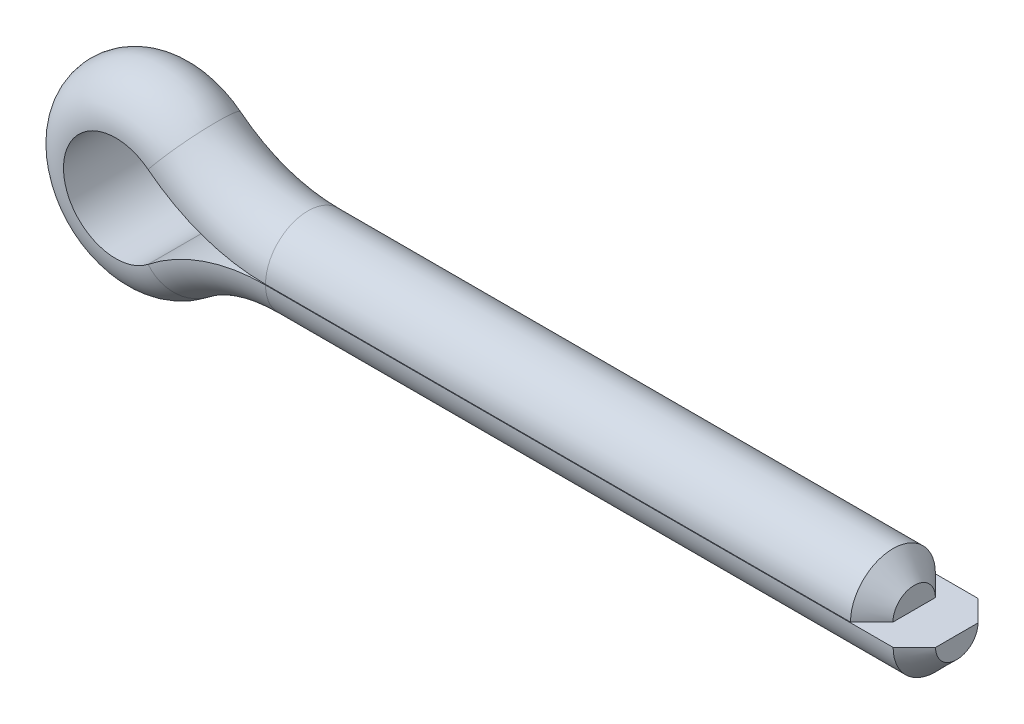
ISO-10303-21;
HEADER;
FILE_DESCRIPTION(('STEP AP214'),'2;1');
FILE_NAME('part.step','',(''),(''),'','','');
FILE_SCHEMA(('AUTOMOTIVE_DESIGN { 1 0 10303 214 1 1 1 1 }'));
ENDSEC;
DATA;
#1=APPLICATION_CONTEXT('core data for automotive mechanical design processes');
#2=APPLICATION_PROTOCOL_DEFINITION('international standard','automotive_design',2000,#1);
#3=PRODUCT_CONTEXT('',#1,'mechanical');
#4=PRODUCT('Part','Part','',(#3));
#5=PRODUCT_RELATED_PRODUCT_CATEGORY('part','',(#4));
#6=PRODUCT_DEFINITION_FORMATION('','',#4);
#7=PRODUCT_DEFINITION_CONTEXT('part definition',#1,'design');
#8=PRODUCT_DEFINITION('design','',#6,#7);
#9=PRODUCT_DEFINITION_SHAPE('','',#8);
#10=(LENGTH_UNIT() NAMED_UNIT(*) SI_UNIT(.MILLI.,.METRE.));
#11=(NAMED_UNIT(*) PLANE_ANGLE_UNIT() SI_UNIT($,.RADIAN.));
#12=(NAMED_UNIT(*) SI_UNIT($,.STERADIAN.) SOLID_ANGLE_UNIT());
#13=UNCERTAINTY_MEASURE_WITH_UNIT(LENGTH_MEASURE(1.E-05),#10,'distance_accuracy_value','');
#14=(GEOMETRIC_REPRESENTATION_CONTEXT(3) GLOBAL_UNCERTAINTY_ASSIGNED_CONTEXT((#13)) GLOBAL_UNIT_ASSIGNED_CONTEXT((#10,
#11,#12)) REPRESENTATION_CONTEXT('',''));
#15=CARTESIAN_POINT('',(0.,0.,0.));
#16=DIRECTION('',(0.,0.,1.));
#17=DIRECTION('',(1.,0.,0.));
#18=AXIS2_PLACEMENT_3D('',#15,#16,#17);
#19=CARTESIAN_POINT('',(-50.7999999999999,-0.0254000000000087,3.556));
#20=DIRECTION('',(0.,-1.,0.));
#21=DIRECTION('',(1.,0.,0.));
#22=AXIS2_PLACEMENT_3D('',#19,#20,#21);
#23=PLANE('',#22);
#24=DIRECTION('',(1.,0.,0.));
#25=VECTOR('',#24,1.);
#26=CARTESIAN_POINT('',(-50.7999999999999,-0.0254000000000087,3.556));
#27=LINE('',#26,#25);
#28=CARTESIAN_POINT('',(-50.7999999999999,-0.0254000000000087,3.556));
#29=VERTEX_POINT('',#28);
#30=CARTESIAN_POINT('',(1.79387500000008,-0.0254000000000087,3.556));
#31=VERTEX_POINT('',#30);
#32=EDGE_CURVE('E157',#29,#31,#27,.T.);
#33=ORIENTED_EDGE('',*,*,#32,.T.);
#34=DIRECTION('',(-0.707106781186541,0.,0.707106781186554));
#35=VECTOR('',#34,1.);
#36=CARTESIAN_POINT('',(5.34987500000003,-0.0254000000000087,0.));
#37=LINE('',#36,#35);
#38=CARTESIAN_POINT('',(3.57187500000009,-0.0254000000000087,1.77799999999997));
#39=VERTEX_POINT('',#38);
#40=EDGE_CURVE('E168',#31,#39,#37,.F.);
#41=ORIENTED_EDGE('',*,*,#40,.T.);
#42=DIRECTION('',(0.,0.,-1.));
#43=VECTOR('',#42,1.);
#44=CARTESIAN_POINT('',(3.57187500000009,-0.0254000000000087,3.556));
#45=LINE('',#44,#43);
#46=CARTESIAN_POINT('',(3.57187500000009,-0.0254000000000087,-1.77799999999997));
#47=VERTEX_POINT('',#46);
#48=EDGE_CURVE('E154',#39,#47,#45,.T.);
#49=ORIENTED_EDGE('',*,*,#48,.T.);
#50=DIRECTION('',(0.707106781186541,0.,0.707106781186554));
#51=VECTOR('',#50,1.);
#52=CARTESIAN_POINT('',(5.34987500000003,-0.0254000000000087,0.));
#53=LINE('',#52,#51);
#54=CARTESIAN_POINT('',(1.79387500000008,-0.0254000000000087,-3.556));
#55=VERTEX_POINT('',#54);
#56=EDGE_CURVE('E166',#47,#55,#53,.F.);
#57=ORIENTED_EDGE('',*,*,#56,.T.);
#58=DIRECTION('',(1.,0.,0.));
#59=VECTOR('',#58,1.);
#60=CARTESIAN_POINT('',(-50.7999999999999,-0.0254000000000087,-3.556));
#61=LINE('',#60,#59);
#62=CARTESIAN_POINT('',(-50.7999999999999,-0.0254000000000087,-3.556));
#63=VERTEX_POINT('',#62);
#64=EDGE_CURVE('E160',#63,#55,#61,.T.);
#65=ORIENTED_EDGE('',*,*,#64,.F.);
#66=DIRECTION('',(0.,0.,-1.));
#67=VECTOR('',#66,1.);
#68=CARTESIAN_POINT('',(-50.7999999999999,-0.0254000000000087,3.556));
#69=LINE('',#68,#67);
#70=EDGE_CURVE('E145',#29,#63,#69,.T.);
#71=ORIENTED_EDGE('',*,*,#70,.F.);
#72=EDGE_LOOP('',(#33,#41,#49,#57,#65,#71));
#73=FACE_BOUND('',#72,.T.);
#74=ADVANCED_FACE('F34',(#73),#23,.F.);
#75=CARTESIAN_POINT('',(-50.7999999999999,-0.0254000000000087,0.));
#76=DIRECTION('',(1.,0.,0.));
#77=DIRECTION('',(0.,1.,0.));
#78=AXIS2_PLACEMENT_3D('',#75,#76,#77);
#79=CYLINDRICAL_SURFACE('',#78,3.556);
#80=ORIENTED_EDGE('',*,*,#64,.T.);
#81=CARTESIAN_POINT('',(1.79387500000008,-0.0254000000000087,0.));
#82=DIRECTION('',(-1.,0.,0.));
#83=DIRECTION('',(0.,-1.,0.));
#84=AXIS2_PLACEMENT_3D('',#81,#82,#83);
#85=CIRCLE('',#84,3.556);
#86=EDGE_CURVE('E163',#55,#31,#85,.T.);
#87=ORIENTED_EDGE('',*,*,#86,.T.);
#88=ORIENTED_EDGE('',*,*,#32,.F.);
#89=CARTESIAN_POINT('',(-50.7999999999999,-0.0254000000000087,0.));
#90=DIRECTION('',(-1.,0.,0.));
#91=DIRECTION('',(0.,0.,-1.));
#92=AXIS2_PLACEMENT_3D('',#89,#90,#91);
#93=CIRCLE('',#92,3.556);
#94=EDGE_CURVE('E142',#63,#29,#93,.T.);
#95=ORIENTED_EDGE('',*,*,#94,.F.);
#96=EDGE_LOOP('',(#80,#87,#88,#95));
#97=FACE_BOUND('',#96,.T.);
#98=ADVANCED_FACE('F188',(#97),#79,.T.);
#99=CARTESIAN_POINT('',(-50.8,-15.9004,0.));
#100=DIRECTION('',(0.,0.,-1.));
#101=DIRECTION('',(-1.,0.,0.));
#102=AXIS2_PLACEMENT_3D('',#99,#100,#101);
#103=CYLINDRICAL_SURFACE('',#102,15.875);
#104=DIRECTION('',(0.,0.,-1.));
#105=VECTOR('',#104,1.);
#106=CARTESIAN_POINT('',(-60.6354410598821,-3.43927147335421,3.556));
#107=LINE('',#106,#105);
#108=CARTESIAN_POINT('',(-60.6354410598821,-3.43927147335421,3.556));
#109=VERTEX_POINT('',#108);
#110=CARTESIAN_POINT('',(-60.6354410598821,-3.43927147335421,-3.556));
#111=VERTEX_POINT('',#110);
#112=EDGE_CURVE('E133',#109,#111,#107,.T.);
#113=ORIENTED_EDGE('',*,*,#112,.F.);
#114=CARTESIAN_POINT('',(-50.8,-15.9004,3.556));
#115=DIRECTION('',(0.,0.,-1.));
#116=DIRECTION('',(-1.,0.,0.));
#117=AXIS2_PLACEMENT_3D('',#114,#115,#116);
#118=CIRCLE('',#117,15.875);
#119=EDGE_CURVE('E148',#109,#29,#118,.T.);
#120=ORIENTED_EDGE('',*,*,#119,.T.);
#121=ORIENTED_EDGE('',*,*,#70,.T.);
#122=CARTESIAN_POINT('',(-50.8,-15.9004,-3.556));
#123=DIRECTION('',(0.,0.,-1.));
#124=DIRECTION('',(-1.,0.,0.));
#125=AXIS2_PLACEMENT_3D('',#122,#123,#124);
#126=CIRCLE('',#125,15.875);
#127=EDGE_CURVE('E151',#111,#63,#126,.T.);
#128=ORIENTED_EDGE('',*,*,#127,.F.);
#129=EDGE_LOOP('',(#113,#120,#121,#128));
#130=FACE_BOUND('',#129,.T.);
#131=ADVANCED_FACE('F194',(#130),#103,.T.);
#132=CARTESIAN_POINT('',(-50.8,-15.9004,0.));
#133=DIRECTION('',(0.,0.,-1.));
#134=DIRECTION('',(-1.,0.,0.));
#135=AXIS2_PLACEMENT_3D('',#132,#133,#134);
#136=TOROIDAL_SURFACE('',#135,15.875,3.556);
#137=CARTESIAN_POINT('',(-60.6354410598821,-3.43927147335421,0.));
#138=DIRECTION('',(-0.784952978056418,-0.61955534235479,0.));
#139=DIRECTION('',(0.,0.,-1.));
#140=AXIS2_PLACEMENT_3D('',#137,#138,#139);
#141=CIRCLE('',#140,3.556);
#142=EDGE_CURVE('E130',#111,#109,#141,.T.);
#143=ORIENTED_EDGE('',*,*,#142,.F.);
#144=ORIENTED_EDGE('',*,*,#127,.T.);
#145=ORIENTED_EDGE('',*,*,#94,.T.);
#146=ORIENTED_EDGE('',*,*,#119,.F.);
#147=EDGE_LOOP('',(#143,#144,#145,#146));
#148=FACE_BOUND('',#147,.T.);
#149=ADVANCED_FACE('F200',(#148),#136,.T.);
#150=CARTESIAN_POINT('',(-63.3500227924096,0.,0.));
#151=DIRECTION('',(0.,0.,1.));
#152=DIRECTION('',(1.,0.,0.));
#153=AXIS2_PLACEMENT_3D('',#150,#151,#152);
#154=CYLINDRICAL_SURFACE('',#153,4.3815);
#155=DIRECTION('',(0.,0.,-1.));
#156=VECTOR('',#155,1.);
#157=CARTESIAN_POINT('',(-60.6354410598821,3.43927147335421,3.556));
#158=LINE('',#157,#156);
#159=CARTESIAN_POINT('',(-60.6354410598821,3.43927147335421,3.556));
#160=VERTEX_POINT('',#159);
#161=CARTESIAN_POINT('',(-60.6354410598821,3.43927147335421,-3.556));
#162=VERTEX_POINT('',#161);
#163=EDGE_CURVE('E110',#160,#162,#158,.T.);
#164=ORIENTED_EDGE('',*,*,#163,.F.);
#165=CARTESIAN_POINT('',(-63.3500227924096,0.,3.556));
#166=DIRECTION('',(0.,0.,1.));
#167=DIRECTION('',(1.,0.,0.));
#168=AXIS2_PLACEMENT_3D('',#165,#166,#167);
#169=CIRCLE('',#168,4.3815);
#170=EDGE_CURVE('E136',#160,#109,#169,.T.);
#171=ORIENTED_EDGE('',*,*,#170,.T.);
#172=ORIENTED_EDGE('',*,*,#112,.T.);
#173=CARTESIAN_POINT('',(-63.3500227924096,0.,-3.556));
#174=DIRECTION('',(0.,0.,1.));
#175=DIRECTION('',(1.,0.,0.));
#176=AXIS2_PLACEMENT_3D('',#173,#174,#175);
#177=CIRCLE('',#176,4.3815);
#178=EDGE_CURVE('E139',#162,#111,#177,.T.);
#179=ORIENTED_EDGE('',*,*,#178,.F.);
#180=EDGE_LOOP('',(#164,#171,#172,#179));
#181=FACE_BOUND('',#180,.T.);
#182=ADVANCED_FACE('F204',(#181),#154,.F.);
#183=CARTESIAN_POINT('',(-63.3500227924096,0.,0.));
#184=DIRECTION('',(0.,0.,1.));
#185=DIRECTION('',(1.,0.,0.));
#186=AXIS2_PLACEMENT_3D('',#183,#184,#185);
#187=TOROIDAL_SURFACE('',#186,4.3815,3.556);
#188=CARTESIAN_POINT('',(-60.6354410598821,3.43927147335421,0.));
#189=DIRECTION('',(0.784952978056426,-0.619555342354779,0.));
#190=DIRECTION('',(0.,0.,-1.));
#191=AXIS2_PLACEMENT_3D('',#188,#189,#190);
#192=CIRCLE('',#191,3.556);
#193=EDGE_CURVE('E106',#162,#160,#192,.T.);
#194=ORIENTED_EDGE('',*,*,#193,.F.);
#195=ORIENTED_EDGE('',*,*,#178,.T.);
#196=ORIENTED_EDGE('',*,*,#142,.T.);
#197=ORIENTED_EDGE('',*,*,#170,.F.);
#198=EDGE_LOOP('',(#194,#195,#196,#197));
#199=FACE_BOUND('',#198,.T.);
#200=ADVANCED_FACE('F208',(#199),#187,.T.);
#201=CARTESIAN_POINT('',(-50.8,15.9004,0.));
#202=DIRECTION('',(0.,0.,-1.));
#203=DIRECTION('',(-1.,0.,0.));
#204=AXIS2_PLACEMENT_3D('',#201,#202,#203);
#205=CYLINDRICAL_SURFACE('',#204,15.875);
#206=DIRECTION('',(0.,0.,-1.));
#207=VECTOR('',#206,1.);
#208=CARTESIAN_POINT('',(-50.8,0.0254000000000087,3.556));
#209=LINE('',#208,#207);
#210=CARTESIAN_POINT('',(-50.8,0.0254000000000087,3.556));
#211=VERTEX_POINT('',#210);
#212=CARTESIAN_POINT('',(-50.8,0.0254000000000087,-3.556));
#213=VERTEX_POINT('',#212);
#214=EDGE_CURVE('E113',#211,#213,#209,.T.);
#215=ORIENTED_EDGE('',*,*,#214,.F.);
#216=CARTESIAN_POINT('',(-50.8,15.9004,3.556));
#217=DIRECTION('',(0.,0.,-1.));
#218=DIRECTION('',(-1.,0.,0.));
#219=AXIS2_PLACEMENT_3D('',#216,#217,#218);
#220=CIRCLE('',#219,15.875);
#221=EDGE_CURVE('E99',#211,#160,#220,.T.);
#222=ORIENTED_EDGE('',*,*,#221,.T.);
#223=ORIENTED_EDGE('',*,*,#163,.T.);
#224=CARTESIAN_POINT('',(-50.8,15.9004,-3.556));
#225=DIRECTION('',(0.,0.,-1.));
#226=DIRECTION('',(-1.,0.,0.));
#227=AXIS2_PLACEMENT_3D('',#224,#225,#226);
#228=CIRCLE('',#227,15.875);
#229=EDGE_CURVE('E109',#213,#162,#228,.T.);
#230=ORIENTED_EDGE('',*,*,#229,.F.);
#231=EDGE_LOOP('',(#215,#222,#223,#230));
#232=FACE_BOUND('',#231,.T.);
#233=ADVANCED_FACE('F114',(#232),#205,.T.);
#234=CARTESIAN_POINT('',(-50.8,15.9004,0.));
#235=DIRECTION('',(0.,0.,-1.));
#236=DIRECTION('',(-1.,0.,0.));
#237=AXIS2_PLACEMENT_3D('',#234,#235,#236);
#238=TOROIDAL_SURFACE('',#237,15.875,3.556);
#239=CARTESIAN_POINT('',(-50.8,0.0254000000000087,0.));
#240=DIRECTION('',(1.,0.,0.));
#241=DIRECTION('',(0.,0.,-1.));
#242=AXIS2_PLACEMENT_3D('',#239,#240,#241);
#243=CIRCLE('',#242,3.556);
#244=EDGE_CURVE('E104',#213,#211,#243,.T.);
#245=ORIENTED_EDGE('',*,*,#244,.F.);
#246=ORIENTED_EDGE('',*,*,#229,.T.);
#247=ORIENTED_EDGE('',*,*,#193,.T.);
#248=ORIENTED_EDGE('',*,*,#221,.F.);
#249=EDGE_LOOP('',(#245,#246,#247,#248));
#250=FACE_BOUND('',#249,.T.);
#251=ADVANCED_FACE('F101',(#250),#238,.T.);
#252=CARTESIAN_POINT('',(-50.8,0.0254000000000087,0.));
#253=DIRECTION('',(1.,0.,0.));
#254=DIRECTION('',(0.,1.,0.));
#255=AXIS2_PLACEMENT_3D('',#252,#253,#254);
#256=CYLINDRICAL_SURFACE('',#255,3.556);
#257=DIRECTION('',(1.,0.,0.));
#258=VECTOR('',#257,1.);
#259=CARTESIAN_POINT('',(-50.8,0.0254000000000087,3.556));
#260=LINE('',#259,#258);
#261=CARTESIAN_POINT('',(-1.778,0.0254000000000087,3.556));
#262=VERTEX_POINT('',#261);
#263=EDGE_CURVE('E115',#211,#262,#260,.T.);
#264=ORIENTED_EDGE('',*,*,#263,.T.);
#265=CARTESIAN_POINT('',(-1.778,0.0254000000000087,0.));
#266=DIRECTION('',(1.,0.,0.));
#267=DIRECTION('',(0.,1.,0.));
#268=AXIS2_PLACEMENT_3D('',#265,#266,#267);
#269=CIRCLE('',#268,3.556);
#270=CARTESIAN_POINT('',(-1.778,0.0254000000000087,-3.556));
#271=VERTEX_POINT('',#270);
#272=EDGE_CURVE('E11',#262,#271,#269,.F.);
#273=ORIENTED_EDGE('',*,*,#272,.T.);
#274=DIRECTION('',(1.,0.,0.));
#275=VECTOR('',#274,1.);
#276=CARTESIAN_POINT('',(-50.8,0.0254000000000087,-3.556));
#277=LINE('',#276,#275);
#278=EDGE_CURVE('E118',#213,#271,#277,.T.);
#279=ORIENTED_EDGE('',*,*,#278,.F.);
#280=ORIENTED_EDGE('',*,*,#244,.T.);
#281=EDGE_LOOP('',(#264,#273,#279,#280));
#282=FACE_BOUND('',#281,.T.);
#283=ADVANCED_FACE('F120',(#282),#256,.T.);
#284=CARTESIAN_POINT('',(-50.8,0.0254000000000087,3.556));
#285=DIRECTION('',(0.,-1.,0.));
#286=DIRECTION('',(1.,0.,0.));
#287=AXIS2_PLACEMENT_3D('',#284,#285,#286);
#288=PLANE('',#287);
#289=DIRECTION('',(0.,0.,-1.));
#290=VECTOR('',#289,1.);
#291=CARTESIAN_POINT('',(0.,0.0254000000000087,3.556));
#292=LINE('',#291,#290);
#293=CARTESIAN_POINT('',(0.,0.0254000000000087,1.778));
#294=VERTEX_POINT('',#293);
#295=CARTESIAN_POINT('',(0.,0.0254000000000087,-1.778));
#296=VERTEX_POINT('',#295);
#297=EDGE_CURVE('E121',#294,#296,#292,.T.);
#298=ORIENTED_EDGE('',*,*,#297,.F.);
#299=DIRECTION('',(-0.707106781186548,0.,0.707106781186547));
#300=VECTOR('',#299,1.);
#301=CARTESIAN_POINT('',(1.778,0.0254000000000087,0.));
#302=LINE('',#301,#300);
#303=EDGE_CURVE('E42',#294,#262,#302,.T.);
#304=ORIENTED_EDGE('',*,*,#303,.T.);
#305=ORIENTED_EDGE('',*,*,#263,.F.);
#306=ORIENTED_EDGE('',*,*,#214,.T.);
#307=ORIENTED_EDGE('',*,*,#278,.T.);
#308=DIRECTION('',(0.707106781186548,0.,0.707106781186547));
#309=VECTOR('',#308,1.);
#310=CARTESIAN_POINT('',(1.778,0.0254000000000087,0.));
#311=LINE('',#310,#309);
#312=EDGE_CURVE('E175',#271,#296,#311,.T.);
#313=ORIENTED_EDGE('',*,*,#312,.T.);
#314=EDGE_LOOP('',(#298,#304,#305,#306,#307,#313));
#315=FACE_BOUND('',#314,.T.);
#316=ADVANCED_FACE('F117',(#315),#288,.T.);
#317=CARTESIAN_POINT('',(3.57187500000009,-0.0254000000000087,0.));
#318=DIRECTION('',(-1.,0.,0.));
#319=DIRECTION('',(0.,0.,-1.));
#320=AXIS2_PLACEMENT_3D('',#317,#318,#319);
#321=PLANE('',#320);
#322=ORIENTED_EDGE('',*,*,#48,.F.);
#323=CARTESIAN_POINT('',(3.57187500000009,-0.0254000000000087,0.));
#324=DIRECTION('',(-1.,0.,0.));
#325=DIRECTION('',(0.,-1.,0.));
#326=AXIS2_PLACEMENT_3D('',#323,#324,#325);
#327=CIRCLE('',#326,1.77799999999997);
#328=EDGE_CURVE('E170',#39,#47,#327,.F.);
#329=ORIENTED_EDGE('',*,*,#328,.T.);
#330=EDGE_LOOP('',(#322,#329));
#331=FACE_BOUND('',#330,.T.);
#332=ADVANCED_FACE('F221',(#331),#321,.F.);
#333=CARTESIAN_POINT('',(0.,0.0254000000000087,0.));
#334=DIRECTION('',(1.,0.,0.));
#335=DIRECTION('',(0.,0.,-1.));
#336=AXIS2_PLACEMENT_3D('',#333,#334,#335);
#337=PLANE('',#336);
#338=ORIENTED_EDGE('',*,*,#297,.T.);
#339=CARTESIAN_POINT('',(0.,0.0254000000000087,0.));
#340=DIRECTION('',(1.,0.,0.));
#341=DIRECTION('',(0.,0.,-1.));
#342=AXIS2_PLACEMENT_3D('',#339,#340,#341);
#343=CIRCLE('',#342,1.778);
#344=EDGE_CURVE('E172',#296,#294,#343,.T.);
#345=ORIENTED_EDGE('',*,*,#344,.T.);
#346=EDGE_LOOP('',(#338,#345));
#347=FACE_BOUND('',#346,.T.);
#348=ADVANCED_FACE('F180',(#347),#337,.T.);
#349=CARTESIAN_POINT('',(1.79387500000008,-0.0254000000000087,0.));
#350=DIRECTION('',(-1.,0.,0.));
#351=DIRECTION('',(0.,-1.,0.));
#352=AXIS2_PLACEMENT_3D('',#349,#350,#351);
#353=CONICAL_SURFACE('',#352,3.556,0.785398163397457);
#354=ORIENTED_EDGE('',*,*,#56,.F.);
#355=ORIENTED_EDGE('',*,*,#328,.F.);
#356=ORIENTED_EDGE('',*,*,#40,.F.);
#357=ORIENTED_EDGE('',*,*,#86,.F.);
#358=EDGE_LOOP('',(#354,#355,#356,#357));
#359=FACE_BOUND('',#358,.T.);
#360=ADVANCED_FACE('F182',(#359),#353,.T.);
#361=CARTESIAN_POINT('',(0.,0.0254000000000087,0.));
#362=DIRECTION('',(-1.,0.,0.));
#363=DIRECTION('',(0.,-1.,0.));
#364=AXIS2_PLACEMENT_3D('',#361,#362,#363);
#365=CONICAL_SURFACE('',#364,1.778,0.785398163397447);
#366=ORIENTED_EDGE('',*,*,#312,.F.);
#367=ORIENTED_EDGE('',*,*,#272,.F.);
#368=ORIENTED_EDGE('',*,*,#303,.F.);
#369=ORIENTED_EDGE('',*,*,#344,.F.);
#370=EDGE_LOOP('',(#366,#367,#368,#369));
#371=FACE_BOUND('',#370,.T.);
#372=ADVANCED_FACE('F36',(#371),#365,.T.);
#373=CLOSED_SHELL('',(#74,#98,#131,#149,#182,#200,#233,#251,#283,#316,#332,#348,#360,#372));
#374=MANIFOLD_SOLID_BREP('B2',#373);
#375=ADVANCED_BREP_SHAPE_REPRESENTATION('',(#18,#374),#14);
#376=SHAPE_DEFINITION_REPRESENTATION(#9,#375);
ENDSEC;
END-ISO-10303-21;
